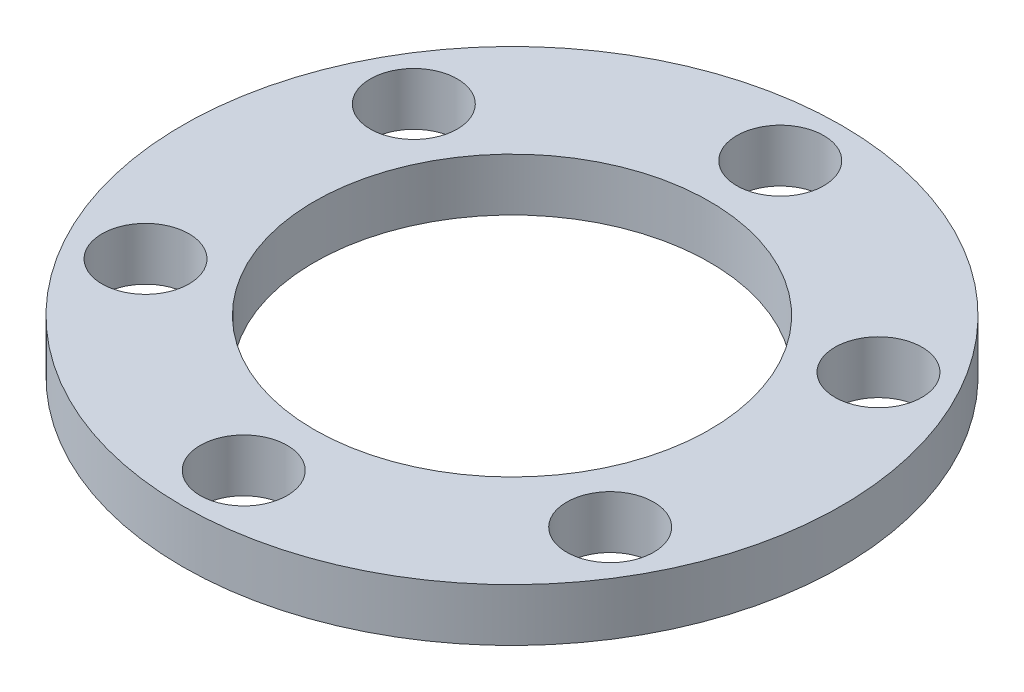
ISO-10303-21;
HEADER;
FILE_DESCRIPTION(('STEP AP214'),'2;1');
FILE_NAME('part.step','',(''),(''),'','','');
FILE_SCHEMA(('AUTOMOTIVE_DESIGN { 1 0 10303 214 1 1 1 1 }'));
ENDSEC;
DATA;
#1=APPLICATION_CONTEXT('core data for automotive mechanical design processes');
#2=APPLICATION_PROTOCOL_DEFINITION('international standard','automotive_design',2000,#1);
#3=PRODUCT_CONTEXT('',#1,'mechanical');
#4=PRODUCT('Part','Part','',(#3));
#5=PRODUCT_RELATED_PRODUCT_CATEGORY('part','',(#4));
#6=PRODUCT_DEFINITION_FORMATION('','',#4);
#7=PRODUCT_DEFINITION_CONTEXT('part definition',#1,'design');
#8=PRODUCT_DEFINITION('design','',#6,#7);
#9=PRODUCT_DEFINITION_SHAPE('','',#8);
#10=(LENGTH_UNIT() NAMED_UNIT(*) SI_UNIT(.MILLI.,.METRE.));
#11=(NAMED_UNIT(*) PLANE_ANGLE_UNIT() SI_UNIT($,.RADIAN.));
#12=(NAMED_UNIT(*) SI_UNIT($,.STERADIAN.) SOLID_ANGLE_UNIT());
#13=UNCERTAINTY_MEASURE_WITH_UNIT(LENGTH_MEASURE(1.E-05),#10,'distance_accuracy_value','');
#14=(GEOMETRIC_REPRESENTATION_CONTEXT(3) GLOBAL_UNCERTAINTY_ASSIGNED_CONTEXT((#13)) GLOBAL_UNIT_ASSIGNED_CONTEXT((#10,
#11,#12)) REPRESENTATION_CONTEXT('',''));
#15=CARTESIAN_POINT('',(0.,0.,0.));
#16=DIRECTION('',(0.,0.,1.));
#17=DIRECTION('',(1.,0.,0.));
#18=AXIS2_PLACEMENT_3D('',#15,#16,#17);
#19=CARTESIAN_POINT('',(0.,2.,0.));
#20=DIRECTION('',(0.,-1.,0.));
#21=DIRECTION('',(0.,0.,-1.));
#22=AXIS2_PLACEMENT_3D('',#19,#20,#21);
#23=CYLINDRICAL_SURFACE('',#22,12.5);
#24=CARTESIAN_POINT('',(0.,2.,0.));
#25=DIRECTION('',(0.,1.,0.));
#26=DIRECTION('',(0.,0.,1.));
#27=AXIS2_PLACEMENT_3D('',#24,#25,#26);
#28=CIRCLE('',#27,12.5);
#29=CARTESIAN_POINT('',(0.,2.,12.5));
#30=VERTEX_POINT('',#29);
#31=EDGE_CURVE('E10',#30,#30,#28,.T.);
#32=ORIENTED_EDGE('',*,*,#31,.F.);
#33=EDGE_LOOP('',(#32));
#34=FACE_BOUND('',#33,.T.);
#35=CARTESIAN_POINT('',(0.,0.,0.));
#36=DIRECTION('',(0.,1.,0.));
#37=DIRECTION('',(0.,0.,1.));
#38=AXIS2_PLACEMENT_3D('',#35,#36,#37);
#39=CIRCLE('',#38,12.5);
#40=CARTESIAN_POINT('',(0.,0.,12.5));
#41=VERTEX_POINT('',#40);
#42=EDGE_CURVE('E38',#41,#41,#39,.T.);
#43=ORIENTED_EDGE('',*,*,#42,.T.);
#44=EDGE_LOOP('',(#43));
#45=FACE_BOUND('',#44,.T.);
#46=ADVANCED_FACE('F35',(#34,#45),#23,.T.);
#47=CARTESIAN_POINT('',(0.,2.,0.));
#48=DIRECTION('',(0.,1.,0.));
#49=DIRECTION('',(0.,0.,1.));
#50=AXIS2_PLACEMENT_3D('',#47,#48,#49);
#51=PLANE('',#50);
#52=CARTESIAN_POINT('',(0.,2.,0.));
#53=DIRECTION('',(0.,1.,0.));
#54=DIRECTION('',(0.,0.,1.));
#55=AXIS2_PLACEMENT_3D('',#52,#53,#54);
#56=CIRCLE('',#55,7.5);
#57=CARTESIAN_POINT('',(0.,2.,7.5));
#58=VERTEX_POINT('',#57);
#59=EDGE_CURVE('E83',#58,#58,#56,.T.);
#60=ORIENTED_EDGE('',*,*,#59,.F.);
#61=EDGE_LOOP('',(#60));
#62=FACE_BOUND('',#61,.T.);
#63=CARTESIAN_POINT('',(8.81278896849059,2.,-5.08806608326954));
#64=DIRECTION('',(0.,-1.,0.));
#65=DIRECTION('',(0.866025403784433,0.,-0.50000000000001));
#66=AXIS2_PLACEMENT_3D('',#63,#64,#65);
#67=CIRCLE('',#66,1.65);
#68=CARTESIAN_POINT('',(10.2417308847349,2.,-5.91306608326956));
#69=VERTEX_POINT('',#68);
#70=EDGE_CURVE('E62',#69,#69,#67,.T.);
#71=ORIENTED_EDGE('',*,*,#70,.T.);
#72=EDGE_LOOP('',(#71));
#73=FACE_BOUND('',#72,.T.);
#74=CARTESIAN_POINT('',(8.8127889684907,2.,5.08806608326936));
#75=DIRECTION('',(0.,-1.,0.));
#76=DIRECTION('',(0.866025403784443,0.,0.499999999999992));
#77=AXIS2_PLACEMENT_3D('',#74,#75,#76);
#78=CIRCLE('',#77,1.65);
#79=CARTESIAN_POINT('',(10.241730884735,2.,5.91306608326935));
#80=VERTEX_POINT('',#79);
#81=EDGE_CURVE('E69',#80,#80,#78,.T.);
#82=ORIENTED_EDGE('',*,*,#81,.T.);
#83=EDGE_LOOP('',(#82));
#84=FACE_BOUND('',#83,.T.);
#85=CARTESIAN_POINT('',(0.,2.,10.1761321665389));
#86=DIRECTION('',(0.,-1.,0.));
#87=DIRECTION('',(0.,0.,1.));
#88=AXIS2_PLACEMENT_3D('',#85,#86,#87);
#89=CIRCLE('',#88,1.65);
#90=CARTESIAN_POINT('',(0.,2.,11.8261321665389));
#91=VERTEX_POINT('',#90);
#92=EDGE_CURVE('E75',#91,#91,#89,.T.);
#93=ORIENTED_EDGE('',*,*,#92,.T.);
#94=EDGE_LOOP('',(#93));
#95=FACE_BOUND('',#94,.T.);
#96=CARTESIAN_POINT('',(-8.81278896849063,2.,5.08806608326948));
#97=DIRECTION('',(0.,-1.,0.));
#98=DIRECTION('',(-0.866025403784436,0.,0.500000000000004));
#99=AXIS2_PLACEMENT_3D('',#96,#97,#98);
#100=CIRCLE('',#99,1.65);
#101=CARTESIAN_POINT('',(-10.2417308847349,2.,5.91306608326949));
#102=VERTEX_POINT('',#101);
#103=EDGE_CURVE('E56',#102,#102,#100,.T.);
#104=ORIENTED_EDGE('',*,*,#103,.T.);
#105=EDGE_LOOP('',(#104));
#106=FACE_BOUND('',#105,.T.);
#107=CARTESIAN_POINT('',(-8.81278896849066,2.,-5.08806608326942));
#108=DIRECTION('',(0.,-1.,0.));
#109=DIRECTION('',(-0.86602540378444,0.,-0.499999999999998));
#110=AXIS2_PLACEMENT_3D('',#107,#108,#109);
#111=CIRCLE('',#110,1.65);
#112=CARTESIAN_POINT('',(-10.241730884735,2.,-5.91306608326942));
#113=VERTEX_POINT('',#112);
#114=EDGE_CURVE('E50',#113,#113,#111,.T.);
#115=ORIENTED_EDGE('',*,*,#114,.T.);
#116=EDGE_LOOP('',(#115));
#117=FACE_BOUND('',#116,.T.);
#118=CARTESIAN_POINT('',(0.,2.,-10.1761321665389));
#119=DIRECTION('',(0.,-1.,0.));
#120=DIRECTION('',(0.,0.,-1.));
#121=AXIS2_PLACEMENT_3D('',#118,#119,#120);
#122=CIRCLE('',#121,1.65);
#123=CARTESIAN_POINT('',(0.,2.,-11.8261321665389));
#124=VERTEX_POINT('',#123);
#125=EDGE_CURVE('E45',#124,#124,#122,.T.);
#126=ORIENTED_EDGE('',*,*,#125,.T.);
#127=EDGE_LOOP('',(#126));
#128=FACE_BOUND('',#127,.T.);
#129=ORIENTED_EDGE('',*,*,#31,.T.);
#130=EDGE_LOOP('',(#129));
#131=FACE_BOUND('',#130,.T.);
#132=ADVANCED_FACE('F99',(#62,#73,#84,#95,#106,#117,#128,#131),#51,.T.);
#133=CARTESIAN_POINT('',(0.,0.,0.));
#134=DIRECTION('',(0.,1.,0.));
#135=DIRECTION('',(0.,0.,1.));
#136=AXIS2_PLACEMENT_3D('',#133,#134,#135);
#137=PLANE('',#136);
#138=CARTESIAN_POINT('',(0.,0.,0.));
#139=DIRECTION('',(0.,1.,0.));
#140=DIRECTION('',(0.,0.,1.));
#141=AXIS2_PLACEMENT_3D('',#138,#139,#140);
#142=CIRCLE('',#141,7.5);
#143=CARTESIAN_POINT('',(0.,0.,7.5));
#144=VERTEX_POINT('',#143);
#145=EDGE_CURVE('E63',#144,#144,#142,.T.);
#146=ORIENTED_EDGE('',*,*,#145,.T.);
#147=EDGE_LOOP('',(#146));
#148=FACE_BOUND('',#147,.T.);
#149=CARTESIAN_POINT('',(8.81278896849059,0.,-5.08806608326954));
#150=DIRECTION('',(0.,-1.,0.));
#151=DIRECTION('',(0.866025403784433,0.,-0.50000000000001));
#152=AXIS2_PLACEMENT_3D('',#149,#150,#151);
#153=CIRCLE('',#152,1.65);
#154=CARTESIAN_POINT('',(10.2417308847349,0.,-5.91306608326956));
#155=VERTEX_POINT('',#154);
#156=EDGE_CURVE('E59',#155,#155,#153,.T.);
#157=ORIENTED_EDGE('',*,*,#156,.F.);
#158=EDGE_LOOP('',(#157));
#159=FACE_BOUND('',#158,.T.);
#160=CARTESIAN_POINT('',(8.8127889684907,0.,5.08806608326936));
#161=DIRECTION('',(0.,-1.,0.));
#162=DIRECTION('',(0.866025403784443,0.,0.499999999999992));
#163=AXIS2_PLACEMENT_3D('',#160,#161,#162);
#164=CIRCLE('',#163,1.65);
#165=CARTESIAN_POINT('',(10.241730884735,0.,5.91306608326935));
#166=VERTEX_POINT('',#165);
#167=EDGE_CURVE('E66',#166,#166,#164,.T.);
#168=ORIENTED_EDGE('',*,*,#167,.F.);
#169=EDGE_LOOP('',(#168));
#170=FACE_BOUND('',#169,.T.);
#171=CARTESIAN_POINT('',(0.,0.,10.1761321665389));
#172=DIRECTION('',(0.,-1.,0.));
#173=DIRECTION('',(0.,0.,1.));
#174=AXIS2_PLACEMENT_3D('',#171,#172,#173);
#175=CIRCLE('',#174,1.65);
#176=CARTESIAN_POINT('',(0.,0.,11.8261321665389));
#177=VERTEX_POINT('',#176);
#178=EDGE_CURVE('E72',#177,#177,#175,.T.);
#179=ORIENTED_EDGE('',*,*,#178,.F.);
#180=EDGE_LOOP('',(#179));
#181=FACE_BOUND('',#180,.T.);
#182=CARTESIAN_POINT('',(-8.81278896849063,0.,5.08806608326948));
#183=DIRECTION('',(0.,-1.,0.));
#184=DIRECTION('',(-0.866025403784436,0.,0.500000000000004));
#185=AXIS2_PLACEMENT_3D('',#182,#183,#184);
#186=CIRCLE('',#185,1.65);
#187=CARTESIAN_POINT('',(-10.2417308847349,0.,5.91306608326949));
#188=VERTEX_POINT('',#187);
#189=EDGE_CURVE('E78',#188,#188,#186,.T.);
#190=ORIENTED_EDGE('',*,*,#189,.F.);
#191=EDGE_LOOP('',(#190));
#192=FACE_BOUND('',#191,.T.);
#193=CARTESIAN_POINT('',(-8.81278896849066,0.,-5.08806608326942));
#194=DIRECTION('',(0.,-1.,0.));
#195=DIRECTION('',(-0.86602540378444,0.,-0.499999999999998));
#196=AXIS2_PLACEMENT_3D('',#193,#194,#195);
#197=CIRCLE('',#196,1.65);
#198=CARTESIAN_POINT('',(-10.241730884735,0.,-5.91306608326942));
#199=VERTEX_POINT('',#198);
#200=EDGE_CURVE('E53',#199,#199,#197,.T.);
#201=ORIENTED_EDGE('',*,*,#200,.F.);
#202=EDGE_LOOP('',(#201));
#203=FACE_BOUND('',#202,.T.);
#204=CARTESIAN_POINT('',(0.,0.,-10.1761321665389));
#205=DIRECTION('',(0.,-1.,0.));
#206=DIRECTION('',(0.,0.,-1.));
#207=AXIS2_PLACEMENT_3D('',#204,#205,#206);
#208=CIRCLE('',#207,1.65);
#209=CARTESIAN_POINT('',(0.,0.,-11.8261321665389));
#210=VERTEX_POINT('',#209);
#211=EDGE_CURVE('E47',#210,#210,#208,.T.);
#212=ORIENTED_EDGE('',*,*,#211,.F.);
#213=EDGE_LOOP('',(#212));
#214=FACE_BOUND('',#213,.T.);
#215=ORIENTED_EDGE('',*,*,#42,.F.);
#216=EDGE_LOOP('',(#215));
#217=FACE_BOUND('',#216,.T.);
#218=ADVANCED_FACE('F89',(#148,#159,#170,#181,#192,#203,#214,#217),#137,.F.);
#219=CARTESIAN_POINT('',(0.,2.,-10.1761321665389));
#220=DIRECTION('',(0.,-1.,0.));
#221=DIRECTION('',(0.,0.,-1.));
#222=AXIS2_PLACEMENT_3D('',#219,#220,#221);
#223=CYLINDRICAL_SURFACE('',#222,1.65);
#224=ORIENTED_EDGE('',*,*,#125,.F.);
#225=EDGE_LOOP('',(#224));
#226=FACE_BOUND('',#225,.T.);
#227=ORIENTED_EDGE('',*,*,#211,.T.);
#228=EDGE_LOOP('',(#227));
#229=FACE_BOUND('',#228,.T.);
#230=ADVANCED_FACE('F115',(#226,#229),#223,.F.);
#231=CARTESIAN_POINT('',(-8.81278896849066,2.,-5.08806608326942));
#232=DIRECTION('',(0.,-1.,0.));
#233=DIRECTION('',(0.,0.,-1.));
#234=AXIS2_PLACEMENT_3D('',#231,#232,#233);
#235=CYLINDRICAL_SURFACE('',#234,1.65);
#236=ORIENTED_EDGE('',*,*,#114,.F.);
#237=EDGE_LOOP('',(#236));
#238=FACE_BOUND('',#237,.T.);
#239=ORIENTED_EDGE('',*,*,#200,.T.);
#240=EDGE_LOOP('',(#239));
#241=FACE_BOUND('',#240,.T.);
#242=ADVANCED_FACE('F118',(#238,#241),#235,.F.);
#243=CARTESIAN_POINT('',(-8.81278896849063,2.,5.08806608326948));
#244=DIRECTION('',(0.,-1.,0.));
#245=DIRECTION('',(0.,0.,-1.));
#246=AXIS2_PLACEMENT_3D('',#243,#244,#245);
#247=CYLINDRICAL_SURFACE('',#246,1.65);
#248=ORIENTED_EDGE('',*,*,#103,.F.);
#249=EDGE_LOOP('',(#248));
#250=FACE_BOUND('',#249,.T.);
#251=ORIENTED_EDGE('',*,*,#189,.T.);
#252=EDGE_LOOP('',(#251));
#253=FACE_BOUND('',#252,.T.);
#254=ADVANCED_FACE('F150',(#250,#253),#247,.F.);
#255=CARTESIAN_POINT('',(0.,2.,10.1761321665389));
#256=DIRECTION('',(0.,-1.,0.));
#257=DIRECTION('',(0.,0.,-1.));
#258=AXIS2_PLACEMENT_3D('',#255,#256,#257);
#259=CYLINDRICAL_SURFACE('',#258,1.65);
#260=ORIENTED_EDGE('',*,*,#92,.F.);
#261=EDGE_LOOP('',(#260));
#262=FACE_BOUND('',#261,.T.);
#263=ORIENTED_EDGE('',*,*,#178,.T.);
#264=EDGE_LOOP('',(#263));
#265=FACE_BOUND('',#264,.T.);
#266=ADVANCED_FACE('F158',(#262,#265),#259,.F.);
#267=CARTESIAN_POINT('',(8.8127889684907,2.,5.08806608326936));
#268=DIRECTION('',(0.,-1.,0.));
#269=DIRECTION('',(0.,0.,-1.));
#270=AXIS2_PLACEMENT_3D('',#267,#268,#269);
#271=CYLINDRICAL_SURFACE('',#270,1.65);
#272=ORIENTED_EDGE('',*,*,#81,.F.);
#273=EDGE_LOOP('',(#272));
#274=FACE_BOUND('',#273,.T.);
#275=ORIENTED_EDGE('',*,*,#167,.T.);
#276=EDGE_LOOP('',(#275));
#277=FACE_BOUND('',#276,.T.);
#278=ADVANCED_FACE('F166',(#274,#277),#271,.F.);
#279=CARTESIAN_POINT('',(8.81278896849059,2.,-5.08806608326954));
#280=DIRECTION('',(0.,-1.,0.));
#281=DIRECTION('',(0.,0.,-1.));
#282=AXIS2_PLACEMENT_3D('',#279,#280,#281);
#283=CYLINDRICAL_SURFACE('',#282,1.65);
#284=ORIENTED_EDGE('',*,*,#70,.F.);
#285=EDGE_LOOP('',(#284));
#286=FACE_BOUND('',#285,.T.);
#287=ORIENTED_EDGE('',*,*,#156,.T.);
#288=EDGE_LOOP('',(#287));
#289=FACE_BOUND('',#288,.T.);
#290=ADVANCED_FACE('F95',(#286,#289),#283,.F.);
#291=CARTESIAN_POINT('',(0.,0.,0.));
#292=DIRECTION('',(0.,1.,0.));
#293=DIRECTION('',(0.,0.,1.));
#294=AXIS2_PLACEMENT_3D('',#291,#292,#293);
#295=CYLINDRICAL_SURFACE('',#294,7.5);
#296=ORIENTED_EDGE('',*,*,#145,.F.);
#297=EDGE_LOOP('',(#296));
#298=FACE_BOUND('',#297,.T.);
#299=ORIENTED_EDGE('',*,*,#59,.T.);
#300=EDGE_LOOP('',(#299));
#301=FACE_BOUND('',#300,.T.);
#302=ADVANCED_FACE('F92',(#298,#301),#295,.F.);
#303=CLOSED_SHELL('',(#46,#132,#218,#230,#242,#254,#266,#278,#290,#302));
#304=MANIFOLD_SOLID_BREP('B2',#303);
#305=ADVANCED_BREP_SHAPE_REPRESENTATION('',(#18,#304),#14);
#306=SHAPE_DEFINITION_REPRESENTATION(#9,#305);
ENDSEC;
END-ISO-10303-21;
